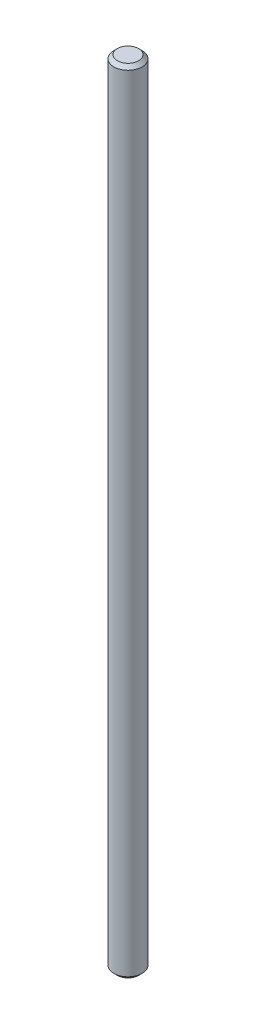
ISO-10303-21;
HEADER;
FILE_DESCRIPTION(('STEP AP214'),'2;1');
FILE_NAME('part.step','',(''),(''),'','','');
FILE_SCHEMA(('AUTOMOTIVE_DESIGN { 1 0 10303 214 1 1 1 1 }'));
ENDSEC;
DATA;
#1=APPLICATION_CONTEXT('core data for automotive mechanical design processes');
#2=APPLICATION_PROTOCOL_DEFINITION('international standard','automotive_design',2000,#1);
#3=PRODUCT_CONTEXT('',#1,'mechanical');
#4=PRODUCT('Part','Part','',(#3));
#5=PRODUCT_RELATED_PRODUCT_CATEGORY('part','',(#4));
#6=PRODUCT_DEFINITION_FORMATION('','',#4);
#7=PRODUCT_DEFINITION_CONTEXT('part definition',#1,'design');
#8=PRODUCT_DEFINITION('design','',#6,#7);
#9=PRODUCT_DEFINITION_SHAPE('','',#8);
#10=(LENGTH_UNIT() NAMED_UNIT(*) SI_UNIT(.MILLI.,.METRE.));
#11=(NAMED_UNIT(*) PLANE_ANGLE_UNIT() SI_UNIT($,.RADIAN.));
#12=(NAMED_UNIT(*) SI_UNIT($,.STERADIAN.) SOLID_ANGLE_UNIT());
#13=UNCERTAINTY_MEASURE_WITH_UNIT(LENGTH_MEASURE(1.E-05),#10,'distance_accuracy_value','');
#14=(GEOMETRIC_REPRESENTATION_CONTEXT(3) GLOBAL_UNCERTAINTY_ASSIGNED_CONTEXT((#13)) GLOBAL_UNIT_ASSIGNED_CONTEXT((#10,
#11,#12)) REPRESENTATION_CONTEXT('',''));
#15=CARTESIAN_POINT('',(0.,0.,0.));
#16=DIRECTION('',(0.,0.,1.));
#17=DIRECTION('',(1.,0.,0.));
#18=AXIS2_PLACEMENT_3D('',#15,#16,#17);
#19=CARTESIAN_POINT('',(0.,224.,0.));
#20=DIRECTION('',(0.,1.,0.));
#21=DIRECTION('',(1.,0.,0.));
#22=AXIS2_PLACEMENT_3D('',#19,#20,#21);
#23=PLANE('',#22);
#24=CARTESIAN_POINT('',(0.,224.,0.));
#25=DIRECTION('',(0.,-1.,0.));
#26=DIRECTION('',(1.,0.,0.));
#27=AXIS2_PLACEMENT_3D('',#24,#25,#26);
#28=CIRCLE('',#27,3.);
#29=CARTESIAN_POINT('',(-3.,224.,0.));
#30=VERTEX_POINT('',#29);
#31=EDGE_CURVE('E20',#30,#30,#28,.T.);
#32=ORIENTED_EDGE('',*,*,#31,.F.);
#33=EDGE_LOOP('',(#32));
#34=FACE_BOUND('',#33,.T.);
#35=ADVANCED_FACE('F16',(#34),#23,.T.);
#36=CARTESIAN_POINT('',(0.,223.5,0.));
#37=DIRECTION('',(0.,-1.,0.));
#38=DIRECTION('',(1.,0.,0.));
#39=AXIS2_PLACEMENT_3D('',#36,#37,#38);
#40=CONICAL_SURFACE('',#39,3.5,0.785398163397441);
#41=ORIENTED_EDGE('',*,*,#31,.T.);
#42=DIRECTION('',(-0.707106781186542,-0.707106781186553,0.));
#43=VECTOR('',#42,1.);
#44=CARTESIAN_POINT('',(-3.5,223.5,0.));
#45=LINE('',#44,#43);
#46=CARTESIAN_POINT('',(-4.,223.,0.));
#47=VERTEX_POINT('',#46);
#48=EDGE_CURVE('E11',#30,#47,#45,.T.);
#49=ORIENTED_EDGE('',*,*,#48,.T.);
#50=CARTESIAN_POINT('',(0.,223.,0.));
#51=DIRECTION('',(0.,1.,0.));
#52=DIRECTION('',(1.,0.,0.));
#53=AXIS2_PLACEMENT_3D('',#50,#51,#52);
#54=CIRCLE('',#53,4.);
#55=EDGE_CURVE('E60',#47,#47,#54,.T.);
#56=ORIENTED_EDGE('',*,*,#55,.T.);
#57=ORIENTED_EDGE('',*,*,#48,.F.);
#58=EDGE_LOOP('',(#41,#49,#56,#57));
#59=FACE_BOUND('',#58,.T.);
#60=ADVANCED_FACE('F18',(#59),#40,.T.);
#61=CARTESIAN_POINT('',(0.,0.,0.));
#62=DIRECTION('',(0.,1.,0.));
#63=DIRECTION('',(1.,0.,0.));
#64=AXIS2_PLACEMENT_3D('',#61,#62,#63);
#65=PLANE('',#64);
#66=CARTESIAN_POINT('',(0.,0.,0.));
#67=DIRECTION('',(0.,1.,0.));
#68=DIRECTION('',(1.,0.,0.));
#69=AXIS2_PLACEMENT_3D('',#66,#67,#68);
#70=CIRCLE('',#69,3.);
#71=CARTESIAN_POINT('',(-3.,0.,0.));
#72=VERTEX_POINT('',#71);
#73=EDGE_CURVE('E70',#72,#72,#70,.T.);
#74=ORIENTED_EDGE('',*,*,#73,.F.);
#75=EDGE_LOOP('',(#74));
#76=FACE_BOUND('',#75,.T.);
#77=ADVANCED_FACE('F77',(#76),#65,.F.);
#78=CARTESIAN_POINT('',(0.,0.,0.));
#79=DIRECTION('',(0.,1.,0.));
#80=DIRECTION('',(1.,0.,0.));
#81=AXIS2_PLACEMENT_3D('',#78,#79,#80);
#82=CYLINDRICAL_SURFACE('',#81,4.);
#83=ORIENTED_EDGE('',*,*,#55,.F.);
#84=DIRECTION('',(0.,-1.,0.));
#85=VECTOR('',#84,1.);
#86=CARTESIAN_POINT('',(-4.,0.,0.));
#87=LINE('',#86,#85);
#88=CARTESIAN_POINT('',(-4.,1.,0.));
#89=VERTEX_POINT('',#88);
#90=EDGE_CURVE('E57',#47,#89,#87,.T.);
#91=ORIENTED_EDGE('',*,*,#90,.T.);
#92=CARTESIAN_POINT('',(0.,1.,0.));
#93=DIRECTION('',(0.,-1.,0.));
#94=DIRECTION('',(1.,0.,0.));
#95=AXIS2_PLACEMENT_3D('',#92,#93,#94);
#96=CIRCLE('',#95,4.);
#97=EDGE_CURVE('E59',#89,#89,#96,.T.);
#98=ORIENTED_EDGE('',*,*,#97,.F.);
#99=ORIENTED_EDGE('',*,*,#90,.F.);
#100=EDGE_LOOP('',(#83,#91,#98,#99));
#101=FACE_BOUND('',#100,.T.);
#102=ADVANCED_FACE('F58',(#101),#82,.T.);
#103=CARTESIAN_POINT('',(0.,0.5,0.));
#104=DIRECTION('',(0.,1.,0.));
#105=DIRECTION('',(1.,0.,0.));
#106=AXIS2_PLACEMENT_3D('',#103,#104,#105);
#107=CONICAL_SURFACE('',#106,3.5,0.785398163397448);
#108=ORIENTED_EDGE('',*,*,#73,.T.);
#109=DIRECTION('',(-0.707106781186547,0.707106781186548,0.));
#110=VECTOR('',#109,1.);
#111=CARTESIAN_POINT('',(-3.5,0.5,0.));
#112=LINE('',#111,#110);
#113=EDGE_CURVE('E48',#72,#89,#112,.T.);
#114=ORIENTED_EDGE('',*,*,#113,.T.);
#115=ORIENTED_EDGE('',*,*,#97,.T.);
#116=ORIENTED_EDGE('',*,*,#113,.F.);
#117=EDGE_LOOP('',(#108,#114,#115,#116));
#118=FACE_BOUND('',#117,.T.);
#119=ADVANCED_FACE('F63',(#118),#107,.T.);
#120=CLOSED_SHELL('',(#35,#60,#77,#102,#119));
#121=MANIFOLD_SOLID_BREP('B1',#120);
#122=ADVANCED_BREP_SHAPE_REPRESENTATION('',(#18,#121),#14);
#123=SHAPE_DEFINITION_REPRESENTATION(#9,#122);
ENDSEC;
END-ISO-10303-21;
